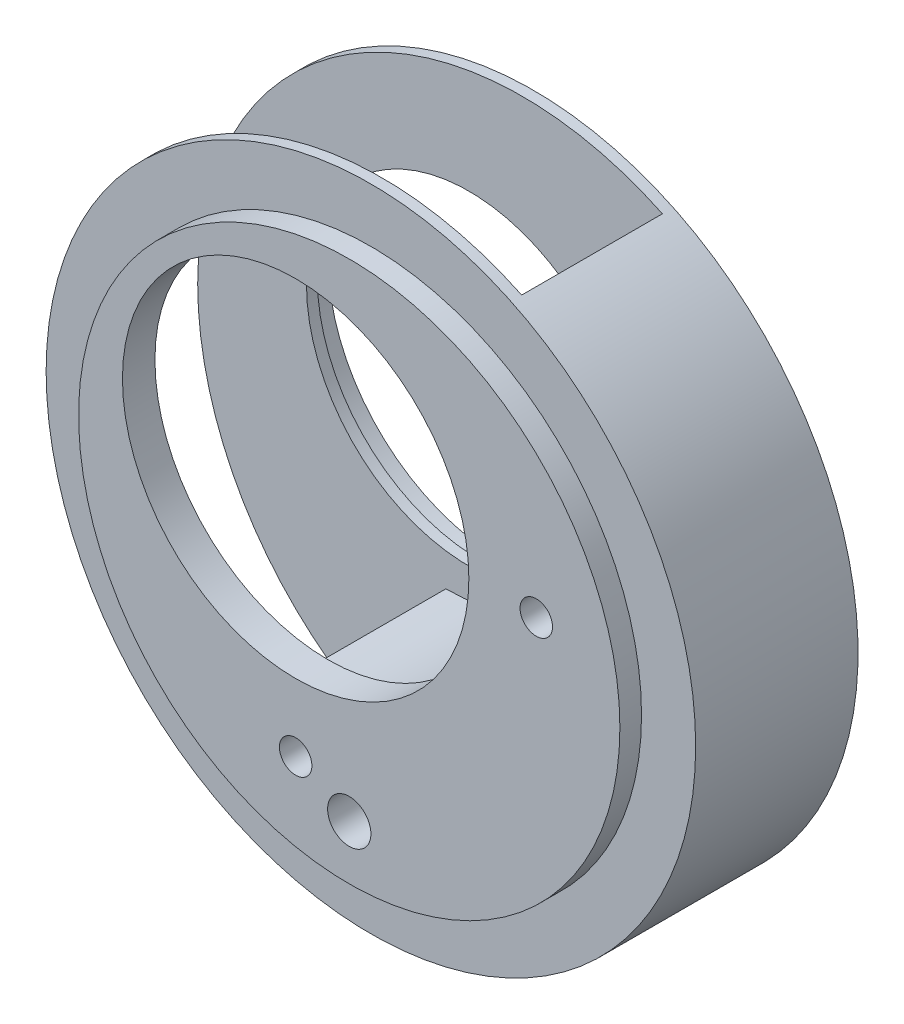
ISO-10303-21;
HEADER;
FILE_DESCRIPTION(('STEP AP214'),'2;1');
FILE_NAME('part.step','',(''),(''),'','','');
FILE_SCHEMA(('AUTOMOTIVE_DESIGN { 1 0 10303 214 1 1 1 1 }'));
ENDSEC;
DATA;
#1=APPLICATION_CONTEXT('core data for automotive mechanical design processes');
#2=APPLICATION_PROTOCOL_DEFINITION('international standard','automotive_design',2000,#1);
#3=PRODUCT_CONTEXT('',#1,'mechanical');
#4=PRODUCT('Part','Part','',(#3));
#5=PRODUCT_RELATED_PRODUCT_CATEGORY('part','',(#4));
#6=PRODUCT_DEFINITION_FORMATION('','',#4);
#7=PRODUCT_DEFINITION_CONTEXT('part definition',#1,'design');
#8=PRODUCT_DEFINITION('design','',#6,#7);
#9=PRODUCT_DEFINITION_SHAPE('','',#8);
#10=(LENGTH_UNIT() NAMED_UNIT(*) SI_UNIT(.MILLI.,.METRE.));
#11=(NAMED_UNIT(*) PLANE_ANGLE_UNIT() SI_UNIT($,.RADIAN.));
#12=(NAMED_UNIT(*) SI_UNIT($,.STERADIAN.) SOLID_ANGLE_UNIT());
#13=UNCERTAINTY_MEASURE_WITH_UNIT(LENGTH_MEASURE(1.E-05),#10,'distance_accuracy_value','');
#14=(GEOMETRIC_REPRESENTATION_CONTEXT(3) GLOBAL_UNCERTAINTY_ASSIGNED_CONTEXT((#13)) GLOBAL_UNIT_ASSIGNED_CONTEXT((#10,
#11,#12)) REPRESENTATION_CONTEXT('',''));
#15=CARTESIAN_POINT('',(0.,0.,0.));
#16=DIRECTION('',(0.,0.,1.));
#17=DIRECTION('',(1.,0.,0.));
#18=AXIS2_PLACEMENT_3D('',#15,#16,#17);
#19=CARTESIAN_POINT('',(-4.94974746830584,4.94974746830582,19.001));
#20=DIRECTION('',(0.,0.,-1.));
#21=DIRECTION('',(-1.,0.,0.));
#22=AXIS2_PLACEMENT_3D('',#19,#20,#21);
#23=CYLINDRICAL_SURFACE('',#22,15.);
#24=CARTESIAN_POINT('',(-4.94974746830584,4.94974746830582,3.));
#25=DIRECTION('',(0.,0.,1.));
#26=DIRECTION('',(1.,0.,0.));
#27=AXIS2_PLACEMENT_3D('',#24,#25,#26);
#28=CIRCLE('',#27,15.);
#29=CARTESIAN_POINT('',(10.0502525316942,4.94974746830582,3.));
#30=VERTEX_POINT('',#29);
#31=EDGE_CURVE('E220',#30,#30,#28,.F.);
#32=ORIENTED_EDGE('',*,*,#31,.F.);
#33=EDGE_LOOP('',(#32));
#34=FACE_BOUND('',#33,.T.);
#35=CARTESIAN_POINT('',(-4.94974746830584,4.94974746830582,2.));
#36=DIRECTION('',(0.,0.,-1.));
#37=DIRECTION('',(-1.,0.,0.));
#38=AXIS2_PLACEMENT_3D('',#35,#36,#37);
#39=CIRCLE('',#38,15.);
#40=CARTESIAN_POINT('',(-19.9497474683058,4.94974746830582,2.));
#41=VERTEX_POINT('',#40);
#42=EDGE_CURVE('E39',#41,#41,#39,.F.);
#43=ORIENTED_EDGE('',*,*,#42,.F.);
#44=EDGE_LOOP('',(#43));
#45=FACE_BOUND('',#44,.T.);
#46=ADVANCED_FACE('F35',(#34,#45),#23,.F.);
#47=CARTESIAN_POINT('',(0.,0.,19.));
#48=DIRECTION('',(0.,0.,-1.));
#49=DIRECTION('',(-1.,0.,0.));
#50=AXIS2_PLACEMENT_3D('',#47,#48,#49);
#51=CYLINDRICAL_SURFACE('',#50,30.);
#52=CARTESIAN_POINT('',(0.,0.,2.));
#53=DIRECTION('',(0.,0.,-1.));
#54=DIRECTION('',(-1.,0.,0.));
#55=AXIS2_PLACEMENT_3D('',#52,#53,#54);
#56=CIRCLE('',#55,30.);
#57=CARTESIAN_POINT('',(-30.,0.,2.));
#58=VERTEX_POINT('',#57);
#59=EDGE_CURVE('E121',#58,#58,#56,.T.);
#60=ORIENTED_EDGE('',*,*,#59,.F.);
#61=EDGE_LOOP('',(#60));
#62=FACE_BOUND('',#61,.T.);
#63=CARTESIAN_POINT('',(0.,0.,17.));
#64=DIRECTION('',(0.,0.,1.));
#65=DIRECTION('',(1.,0.,0.));
#66=AXIS2_PLACEMENT_3D('',#63,#64,#65);
#67=CIRCLE('',#66,30.);
#68=CARTESIAN_POINT('',(30.,0.,17.));
#69=VERTEX_POINT('',#68);
#70=EDGE_CURVE('E11',#69,#69,#67,.T.);
#71=ORIENTED_EDGE('',*,*,#70,.F.);
#72=EDGE_LOOP('',(#71));
#73=FACE_BOUND('',#72,.T.);
#74=CARTESIAN_POINT('',(0.,0.,3.));
#75=DIRECTION('',(0.,0.,1.));
#76=DIRECTION('',(1.,0.,0.));
#77=AXIS2_PLACEMENT_3D('',#74,#75,#76);
#78=CIRCLE('',#77,30.);
#79=CARTESIAN_POINT('',(12.9289321881345,27.0710678118655,3.));
#80=VERTEX_POINT('',#79);
#81=CARTESIAN_POINT('',(-7.07106781186547,-29.1547594742265,3.));
#82=VERTEX_POINT('',#81);
#83=EDGE_CURVE('E100',#80,#82,#78,.T.);
#84=ORIENTED_EDGE('',*,*,#83,.F.);
#85=DIRECTION('',(0.,0.,1.));
#86=VECTOR('',#85,1.);
#87=CARTESIAN_POINT('',(12.9289321881345,27.0710678118655,3.));
#88=LINE('',#87,#86);
#89=CARTESIAN_POINT('',(12.9289321881345,27.0710678118655,16.));
#90=VERTEX_POINT('',#89);
#91=EDGE_CURVE('E60',#80,#90,#88,.T.);
#92=ORIENTED_EDGE('',*,*,#91,.T.);
#93=CARTESIAN_POINT('',(0.,0.,16.));
#94=DIRECTION('',(0.,0.,1.));
#95=DIRECTION('',(1.,0.,0.));
#96=AXIS2_PLACEMENT_3D('',#93,#94,#95);
#97=CIRCLE('',#96,30.);
#98=CARTESIAN_POINT('',(-7.07106781186547,-29.1547594742265,16.));
#99=VERTEX_POINT('',#98);
#100=EDGE_CURVE('E76',#90,#99,#97,.T.);
#101=ORIENTED_EDGE('',*,*,#100,.T.);
#102=DIRECTION('',(0.,0.,1.));
#103=VECTOR('',#102,1.);
#104=CARTESIAN_POINT('',(-7.07106781186547,-29.1547594742265,3.));
#105=LINE('',#104,#103);
#106=EDGE_CURVE('E90',#82,#99,#105,.T.);
#107=ORIENTED_EDGE('',*,*,#106,.F.);
#108=EDGE_LOOP('',(#84,#92,#101,#107));
#109=FACE_BOUND('',#108,.T.);
#110=ADVANCED_FACE('F37',(#62,#73,#109),#51,.T.);
#111=CARTESIAN_POINT('',(0.,0.,17.));
#112=DIRECTION('',(0.,0.,1.));
#113=DIRECTION('',(1.,0.,0.));
#114=AXIS2_PLACEMENT_3D('',#111,#112,#113);
#115=PLANE('',#114);
#116=CARTESIAN_POINT('',(0.,0.,17.));
#117=DIRECTION('',(0.,0.,1.));
#118=DIRECTION('',(1.,0.,0.));
#119=AXIS2_PLACEMENT_3D('',#116,#117,#118);
#120=CIRCLE('',#119,25.);
#121=CARTESIAN_POINT('',(25.,0.,17.));
#122=VERTEX_POINT('',#121);
#123=EDGE_CURVE('E44',#122,#122,#120,.T.);
#124=ORIENTED_EDGE('',*,*,#123,.F.);
#125=EDGE_LOOP('',(#124));
#126=FACE_BOUND('',#125,.T.);
#127=ORIENTED_EDGE('',*,*,#70,.T.);
#128=EDGE_LOOP('',(#127));
#129=FACE_BOUND('',#128,.T.);
#130=ADVANCED_FACE('F136',(#126,#129),#115,.T.);
#131=CARTESIAN_POINT('',(0.,0.,17.));
#132=DIRECTION('',(0.,0.,1.));
#133=DIRECTION('',(1.,0.,0.));
#134=AXIS2_PLACEMENT_3D('',#131,#132,#133);
#135=CYLINDRICAL_SURFACE('',#134,25.);
#136=ORIENTED_EDGE('',*,*,#123,.T.);
#137=EDGE_LOOP('',(#136));
#138=FACE_BOUND('',#137,.T.);
#139=CARTESIAN_POINT('',(0.,0.,19.));
#140=DIRECTION('',(0.,0.,1.));
#141=DIRECTION('',(1.,0.,0.));
#142=AXIS2_PLACEMENT_3D('',#139,#140,#141);
#143=CIRCLE('',#142,25.);
#144=CARTESIAN_POINT('',(25.,0.,19.));
#145=VERTEX_POINT('',#144);
#146=EDGE_CURVE('E126',#145,#145,#143,.T.);
#147=ORIENTED_EDGE('',*,*,#146,.F.);
#148=EDGE_LOOP('',(#147));
#149=FACE_BOUND('',#148,.T.);
#150=ADVANCED_FACE('F134',(#138,#149),#135,.T.);
#151=CARTESIAN_POINT('',(0.,0.,19.));
#152=DIRECTION('',(0.,0.,1.));
#153=DIRECTION('',(1.,0.,0.));
#154=AXIS2_PLACEMENT_3D('',#151,#152,#153);
#155=PLANE('',#154);
#156=CARTESIAN_POINT('',(-4.94974746830583,-17.2776770206899,19.));
#157=DIRECTION('',(0.,0.,1.));
#158=DIRECTION('',(1.,0.,0.));
#159=AXIS2_PLACEMENT_3D('',#156,#157,#158);
#160=CIRCLE('',#159,1.5);
#161=CARTESIAN_POINT('',(-3.44974746830583,-17.2776770206899,19.));
#162=VERTEX_POINT('',#161);
#163=EDGE_CURVE('E268',#162,#162,#160,.T.);
#164=ORIENTED_EDGE('',*,*,#163,.F.);
#165=EDGE_LOOP('',(#164));
#166=FACE_BOUND('',#165,.T.);
#167=CARTESIAN_POINT('',(17.2776770206899,4.94974746830584,19.));
#168=DIRECTION('',(0.,0.,1.));
#169=DIRECTION('',(1.,0.,0.));
#170=AXIS2_PLACEMENT_3D('',#167,#168,#169);
#171=CIRCLE('',#170,1.5);
#172=CARTESIAN_POINT('',(18.7776770206899,4.94974746830584,19.));
#173=VERTEX_POINT('',#172);
#174=EDGE_CURVE('E277',#173,#173,#171,.T.);
#175=ORIENTED_EDGE('',*,*,#174,.F.);
#176=EDGE_LOOP('',(#175));
#177=FACE_BOUND('',#176,.T.);
#178=CARTESIAN_POINT('',(0.,-20.,19.));
#179=DIRECTION('',(0.,0.,1.));
#180=DIRECTION('',(1.,0.,0.));
#181=AXIS2_PLACEMENT_3D('',#178,#179,#180);
#182=CIRCLE('',#181,2.);
#183=CARTESIAN_POINT('',(2.,-20.,19.));
#184=VERTEX_POINT('',#183);
#185=EDGE_CURVE('E216',#184,#184,#182,.T.);
#186=ORIENTED_EDGE('',*,*,#185,.F.);
#187=EDGE_LOOP('',(#186));
#188=FACE_BOUND('',#187,.T.);
#189=CARTESIAN_POINT('',(-4.94974746830583,4.94974746830584,19.));
#190=DIRECTION('',(0.,0.,1.));
#191=DIRECTION('',(1.,0.,0.));
#192=AXIS2_PLACEMENT_3D('',#189,#190,#191);
#193=CIRCLE('',#192,16.);
#194=CARTESIAN_POINT('',(11.0502525316942,4.94974746830584,19.));
#195=VERTEX_POINT('',#194);
#196=EDGE_CURVE('E223',#195,#195,#193,.T.);
#197=ORIENTED_EDGE('',*,*,#196,.F.);
#198=EDGE_LOOP('',(#197));
#199=FACE_BOUND('',#198,.T.);
#200=ORIENTED_EDGE('',*,*,#146,.T.);
#201=EDGE_LOOP('',(#200));
#202=FACE_BOUND('',#201,.T.);
#203=ADVANCED_FACE('F132',(#166,#177,#188,#199,#202),#155,.T.);
#204=CARTESIAN_POINT('',(0.,0.,2.));
#205=DIRECTION('',(0.,0.,-1.));
#206=DIRECTION('',(-1.,0.,0.));
#207=AXIS2_PLACEMENT_3D('',#204,#205,#206);
#208=PLANE('',#207);
#209=CARTESIAN_POINT('',(0.,0.,2.));
#210=DIRECTION('',(0.,0.,-1.));
#211=DIRECTION('',(-1.,0.,0.));
#212=AXIS2_PLACEMENT_3D('',#209,#210,#211);
#213=CIRCLE('',#212,25.);
#214=CARTESIAN_POINT('',(-25.,0.,2.));
#215=VERTEX_POINT('',#214);
#216=EDGE_CURVE('E118',#215,#215,#213,.T.);
#217=ORIENTED_EDGE('',*,*,#216,.F.);
#218=EDGE_LOOP('',(#217));
#219=FACE_BOUND('',#218,.T.);
#220=ORIENTED_EDGE('',*,*,#59,.T.);
#221=EDGE_LOOP('',(#220));
#222=FACE_BOUND('',#221,.T.);
#223=ADVANCED_FACE('F144',(#219,#222),#208,.T.);
#224=CARTESIAN_POINT('',(0.,0.,2.));
#225=DIRECTION('',(0.,0.,-1.));
#226=DIRECTION('',(-1.,0.,0.));
#227=AXIS2_PLACEMENT_3D('',#224,#225,#226);
#228=CYLINDRICAL_SURFACE('',#227,25.);
#229=ORIENTED_EDGE('',*,*,#216,.T.);
#230=EDGE_LOOP('',(#229));
#231=FACE_BOUND('',#230,.T.);
#232=CARTESIAN_POINT('',(0.,0.,0.));
#233=DIRECTION('',(0.,0.,-1.));
#234=DIRECTION('',(-1.,0.,0.));
#235=AXIS2_PLACEMENT_3D('',#232,#233,#234);
#236=CIRCLE('',#235,25.);
#237=CARTESIAN_POINT('',(-25.,0.,0.));
#238=VERTEX_POINT('',#237);
#239=EDGE_CURVE('E115',#238,#238,#236,.T.);
#240=ORIENTED_EDGE('',*,*,#239,.F.);
#241=EDGE_LOOP('',(#240));
#242=FACE_BOUND('',#241,.T.);
#243=ADVANCED_FACE('F185',(#231,#242),#228,.T.);
#244=CARTESIAN_POINT('',(0.,0.,0.));
#245=DIRECTION('',(0.,0.,1.));
#246=DIRECTION('',(1.,0.,0.));
#247=AXIS2_PLACEMENT_3D('',#244,#245,#246);
#248=PLANE('',#247);
#249=CARTESIAN_POINT('',(-4.94974746830584,4.94974746830582,0.));
#250=DIRECTION('',(0.,0.,-1.));
#251=DIRECTION('',(-1.,0.,0.));
#252=AXIS2_PLACEMENT_3D('',#249,#250,#251);
#253=CIRCLE('',#252,16.);
#254=CARTESIAN_POINT('',(-20.9497474683058,4.94974746830582,0.));
#255=VERTEX_POINT('',#254);
#256=EDGE_CURVE('E208',#255,#255,#253,.T.);
#257=ORIENTED_EDGE('',*,*,#256,.F.);
#258=EDGE_LOOP('',(#257));
#259=FACE_BOUND('',#258,.T.);
#260=ORIENTED_EDGE('',*,*,#239,.T.);
#261=EDGE_LOOP('',(#260));
#262=FACE_BOUND('',#261,.T.);
#263=ADVANCED_FACE('F180',(#259,#262),#248,.F.);
#264=CARTESIAN_POINT('',(7.07106781186545,21.2132034355964,3.));
#265=DIRECTION('',(0.707106781186549,-0.707106781186546,0.));
#266=DIRECTION('',(0.707106781186546,0.707106781186549,0.));
#267=AXIS2_PLACEMENT_3D('',#264,#265,#266);
#268=PLANE('',#267);
#269=DIRECTION('',(0.707106781186546,0.707106781186549,0.));
#270=VECTOR('',#269,1.);
#271=CARTESIAN_POINT('',(7.07106781186545,21.2132034355964,16.));
#272=LINE('',#271,#270);
#273=CARTESIAN_POINT('',(7.07106781186545,21.2132034355964,16.));
#274=VERTEX_POINT('',#273);
#275=EDGE_CURVE('E103',#274,#90,#272,.T.);
#276=ORIENTED_EDGE('',*,*,#275,.T.);
#277=ORIENTED_EDGE('',*,*,#91,.F.);
#278=DIRECTION('',(0.707106781186546,0.707106781186549,0.));
#279=VECTOR('',#278,1.);
#280=CARTESIAN_POINT('',(7.07106781186545,21.2132034355964,3.));
#281=LINE('',#280,#279);
#282=CARTESIAN_POINT('',(7.07106781186545,21.2132034355964,3.));
#283=VERTEX_POINT('',#282);
#284=EDGE_CURVE('E96',#283,#80,#281,.T.);
#285=ORIENTED_EDGE('',*,*,#284,.F.);
#286=DIRECTION('',(0.,0.,1.));
#287=VECTOR('',#286,1.);
#288=CARTESIAN_POINT('',(7.07106781186545,21.2132034355964,3.));
#289=LINE('',#288,#287);
#290=EDGE_CURVE('E89',#283,#274,#289,.T.);
#291=ORIENTED_EDGE('',*,*,#290,.T.);
#292=EDGE_LOOP('',(#276,#277,#285,#291));
#293=FACE_BOUND('',#292,.T.);
#294=ADVANCED_FACE('F177',(#293),#268,.F.);
#295=CARTESIAN_POINT('',(-7.07106781186547,7.07106781186547,3.));
#296=DIRECTION('',(0.,0.,1.));
#297=DIRECTION('',(1.,0.,0.));
#298=AXIS2_PLACEMENT_3D('',#295,#296,#297);
#299=CYLINDRICAL_SURFACE('',#298,20.);
#300=CARTESIAN_POINT('',(-7.07106781186547,7.07106781186547,16.));
#301=DIRECTION('',(0.,0.,1.));
#302=DIRECTION('',(1.,0.,0.));
#303=AXIS2_PLACEMENT_3D('',#300,#301,#302);
#304=CIRCLE('',#303,20.);
#305=CARTESIAN_POINT('',(-7.07106781186548,-12.9289321881345,16.));
#306=VERTEX_POINT('',#305);
#307=EDGE_CURVE('E111',#306,#274,#304,.T.);
#308=ORIENTED_EDGE('',*,*,#307,.T.);
#309=ORIENTED_EDGE('',*,*,#290,.F.);
#310=CARTESIAN_POINT('',(-7.07106781186547,7.07106781186547,3.));
#311=DIRECTION('',(0.,0.,1.));
#312=DIRECTION('',(1.,0.,0.));
#313=AXIS2_PLACEMENT_3D('',#310,#311,#312);
#314=CIRCLE('',#313,20.);
#315=CARTESIAN_POINT('',(-7.07106781186548,-12.9289321881345,3.));
#316=VERTEX_POINT('',#315);
#317=EDGE_CURVE('E93',#316,#283,#314,.T.);
#318=ORIENTED_EDGE('',*,*,#317,.F.);
#319=DIRECTION('',(0.,0.,1.));
#320=VECTOR('',#319,1.);
#321=CARTESIAN_POINT('',(-7.07106781186548,-12.9289321881345,3.));
#322=LINE('',#321,#320);
#323=EDGE_CURVE('E84',#316,#306,#322,.T.);
#324=ORIENTED_EDGE('',*,*,#323,.T.);
#325=EDGE_LOOP('',(#308,#309,#318,#324));
#326=FACE_BOUND('',#325,.T.);
#327=ADVANCED_FACE('F94',(#326),#299,.F.);
#328=CARTESIAN_POINT('',(-7.07106781186547,-12.9289321881345,3.));
#329=DIRECTION('',(1.,0.,0.));
#330=DIRECTION('',(0.,0.,-1.));
#331=AXIS2_PLACEMENT_3D('',#328,#329,#330);
#332=PLANE('',#331);
#333=DIRECTION('',(0.,1.,0.));
#334=VECTOR('',#333,1.);
#335=CARTESIAN_POINT('',(-7.07106781186547,-12.9289321881345,16.));
#336=LINE('',#335,#334);
#337=EDGE_CURVE('E51',#99,#306,#336,.T.);
#338=ORIENTED_EDGE('',*,*,#337,.T.);
#339=ORIENTED_EDGE('',*,*,#323,.F.);
#340=DIRECTION('',(0.,1.,0.));
#341=VECTOR('',#340,1.);
#342=CARTESIAN_POINT('',(-7.07106781186547,-12.9289321881345,3.));
#343=LINE('',#342,#341);
#344=EDGE_CURVE('E82',#82,#316,#343,.T.);
#345=ORIENTED_EDGE('',*,*,#344,.F.);
#346=ORIENTED_EDGE('',*,*,#106,.T.);
#347=EDGE_LOOP('',(#338,#339,#345,#346));
#348=FACE_BOUND('',#347,.T.);
#349=ADVANCED_FACE('F86',(#348),#332,.F.);
#350=CARTESIAN_POINT('',(0.,0.,3.));
#351=DIRECTION('',(0.,0.,1.));
#352=DIRECTION('',(1.,0.,0.));
#353=AXIS2_PLACEMENT_3D('',#350,#351,#352);
#354=PLANE('',#353);
#355=ORIENTED_EDGE('',*,*,#31,.T.);
#356=EDGE_LOOP('',(#355));
#357=FACE_BOUND('',#356,.T.);
#358=ORIENTED_EDGE('',*,*,#83,.T.);
#359=ORIENTED_EDGE('',*,*,#344,.T.);
#360=ORIENTED_EDGE('',*,*,#317,.T.);
#361=ORIENTED_EDGE('',*,*,#284,.T.);
#362=EDGE_LOOP('',(#358,#359,#360,#361));
#363=FACE_BOUND('',#362,.T.);
#364=ADVANCED_FACE('F98',(#357,#363),#354,.T.);
#365=CARTESIAN_POINT('',(0.,0.,16.));
#366=DIRECTION('',(0.,0.,1.));
#367=DIRECTION('',(1.,0.,0.));
#368=AXIS2_PLACEMENT_3D('',#365,#366,#367);
#369=PLANE('',#368);
#370=CARTESIAN_POINT('',(-4.94974746830583,4.94974746830584,16.));
#371=DIRECTION('',(0.,0.,1.));
#372=DIRECTION('',(1.,0.,0.));
#373=AXIS2_PLACEMENT_3D('',#370,#371,#372);
#374=CIRCLE('',#373,16.);
#375=CARTESIAN_POINT('',(11.0502525316942,4.94974746830584,16.));
#376=VERTEX_POINT('',#375);
#377=EDGE_CURVE('E109',#376,#376,#374,.F.);
#378=ORIENTED_EDGE('',*,*,#377,.F.);
#379=EDGE_LOOP('',(#378));
#380=FACE_BOUND('',#379,.T.);
#381=ORIENTED_EDGE('',*,*,#100,.F.);
#382=ORIENTED_EDGE('',*,*,#275,.F.);
#383=ORIENTED_EDGE('',*,*,#307,.F.);
#384=ORIENTED_EDGE('',*,*,#337,.F.);
#385=EDGE_LOOP('',(#381,#382,#383,#384));
#386=FACE_BOUND('',#385,.T.);
#387=ADVANCED_FACE('F169',(#380,#386),#369,.F.);
#388=CARTESIAN_POINT('',(-4.94974746830583,4.94974746830584,-0.001000000000001));
#389=DIRECTION('',(0.,0.,1.));
#390=DIRECTION('',(1.,0.,0.));
#391=AXIS2_PLACEMENT_3D('',#388,#389,#390);
#392=CYLINDRICAL_SURFACE('',#391,16.);
#393=ORIENTED_EDGE('',*,*,#196,.T.);
#394=EDGE_LOOP('',(#393));
#395=FACE_BOUND('',#394,.T.);
#396=ORIENTED_EDGE('',*,*,#377,.T.);
#397=EDGE_LOOP('',(#396));
#398=FACE_BOUND('',#397,.T.);
#399=ADVANCED_FACE('F165',(#395,#398),#392,.F.);
#400=CARTESIAN_POINT('',(-4.94974746830584,4.94974746830582,2.));
#401=DIRECTION('',(0.,0.,-1.));
#402=DIRECTION('',(-1.,0.,0.));
#403=AXIS2_PLACEMENT_3D('',#400,#401,#402);
#404=PLANE('',#403);
#405=CARTESIAN_POINT('',(-4.94974746830584,4.94974746830582,2.));
#406=DIRECTION('',(0.,0.,-1.));
#407=DIRECTION('',(-1.,0.,0.));
#408=AXIS2_PLACEMENT_3D('',#405,#406,#407);
#409=CIRCLE('',#408,16.);
#410=CARTESIAN_POINT('',(-20.9497474683058,4.94974746830582,2.));
#411=VERTEX_POINT('',#410);
#412=EDGE_CURVE('E210',#411,#411,#409,.T.);
#413=ORIENTED_EDGE('',*,*,#412,.T.);
#414=EDGE_LOOP('',(#413));
#415=FACE_BOUND('',#414,.T.);
#416=ORIENTED_EDGE('',*,*,#42,.T.);
#417=EDGE_LOOP('',(#416));
#418=FACE_BOUND('',#417,.T.);
#419=ADVANCED_FACE('F168',(#415,#418),#404,.T.);
#420=CARTESIAN_POINT('',(-4.94974746830584,4.94974746830582,2.));
#421=DIRECTION('',(0.,0.,-1.));
#422=DIRECTION('',(-1.,0.,0.));
#423=AXIS2_PLACEMENT_3D('',#420,#421,#422);
#424=CYLINDRICAL_SURFACE('',#423,16.);
#425=ORIENTED_EDGE('',*,*,#412,.F.);
#426=EDGE_LOOP('',(#425));
#427=FACE_BOUND('',#426,.T.);
#428=ORIENTED_EDGE('',*,*,#256,.T.);
#429=EDGE_LOOP('',(#428));
#430=FACE_BOUND('',#429,.T.);
#431=ADVANCED_FACE('F163',(#427,#430),#424,.F.);
#432=CARTESIAN_POINT('',(0.,-20.,16.));
#433=DIRECTION('',(0.,0.,1.));
#434=DIRECTION('',(1.,0.,0.));
#435=AXIS2_PLACEMENT_3D('',#432,#433,#434);
#436=CYLINDRICAL_SURFACE('',#435,2.);
#437=CARTESIAN_POINT('',(0.,-20.,16.));
#438=DIRECTION('',(0.,0.,1.));
#439=DIRECTION('',(1.,0.,0.));
#440=AXIS2_PLACEMENT_3D('',#437,#438,#439);
#441=CIRCLE('',#440,2.);
#442=CARTESIAN_POINT('',(2.,-20.,16.));
#443=VERTEX_POINT('',#442);
#444=EDGE_CURVE('E211',#443,#443,#441,.T.);
#445=ORIENTED_EDGE('',*,*,#444,.F.);
#446=EDGE_LOOP('',(#445));
#447=FACE_BOUND('',#446,.T.);
#448=ORIENTED_EDGE('',*,*,#185,.T.);
#449=EDGE_LOOP('',(#448));
#450=FACE_BOUND('',#449,.T.);
#451=ADVANCED_FACE('F238',(#447,#450),#436,.F.);
#452=CARTESIAN_POINT('',(0.,-20.,16.));
#453=DIRECTION('',(0.,0.,1.));
#454=DIRECTION('',(1.,0.,0.));
#455=AXIS2_PLACEMENT_3D('',#452,#453,#454);
#456=PLANE('',#455);
#457=ORIENTED_EDGE('',*,*,#444,.T.);
#458=EDGE_LOOP('',(#457));
#459=FACE_BOUND('',#458,.T.);
#460=ADVANCED_FACE('F243',(#459),#456,.T.);
#461=CARTESIAN_POINT('',(17.2776770206899,4.94974746830584,16.));
#462=DIRECTION('',(0.,0.,1.));
#463=DIRECTION('',(1.,0.,0.));
#464=AXIS2_PLACEMENT_3D('',#461,#462,#463);
#465=CYLINDRICAL_SURFACE('',#464,1.5);
#466=CARTESIAN_POINT('',(17.2776770206899,4.94974746830584,16.));
#467=DIRECTION('',(0.,0.,1.));
#468=DIRECTION('',(1.,0.,0.));
#469=AXIS2_PLACEMENT_3D('',#466,#467,#468);
#470=CIRCLE('',#469,1.5);
#471=CARTESIAN_POINT('',(18.7776770206899,4.94974746830584,16.));
#472=VERTEX_POINT('',#471);
#473=EDGE_CURVE('E272',#472,#472,#470,.T.);
#474=ORIENTED_EDGE('',*,*,#473,.F.);
#475=EDGE_LOOP('',(#474));
#476=FACE_BOUND('',#475,.T.);
#477=ORIENTED_EDGE('',*,*,#174,.T.);
#478=EDGE_LOOP('',(#477));
#479=FACE_BOUND('',#478,.T.);
#480=ADVANCED_FACE('F247',(#476,#479),#465,.F.);
#481=CARTESIAN_POINT('',(17.2776770206899,4.94974746830584,16.));
#482=DIRECTION('',(0.,0.,1.));
#483=DIRECTION('',(1.,0.,0.));
#484=AXIS2_PLACEMENT_3D('',#481,#482,#483);
#485=PLANE('',#484);
#486=ORIENTED_EDGE('',*,*,#473,.T.);
#487=EDGE_LOOP('',(#486));
#488=FACE_BOUND('',#487,.T.);
#489=ADVANCED_FACE('F251',(#488),#485,.T.);
#490=CARTESIAN_POINT('',(-4.94974746830583,-17.2776770206899,16.));
#491=DIRECTION('',(0.,0.,1.));
#492=DIRECTION('',(1.,0.,0.));
#493=AXIS2_PLACEMENT_3D('',#490,#491,#492);
#494=CYLINDRICAL_SURFACE('',#493,1.5);
#495=CARTESIAN_POINT('',(-4.94974746830583,-17.2776770206899,16.));
#496=DIRECTION('',(0.,0.,1.));
#497=DIRECTION('',(1.,0.,0.));
#498=AXIS2_PLACEMENT_3D('',#495,#496,#497);
#499=CIRCLE('',#498,1.5);
#500=CARTESIAN_POINT('',(-3.44974746830583,-17.2776770206899,16.));
#501=VERTEX_POINT('',#500);
#502=EDGE_CURVE('E267',#501,#501,#499,.T.);
#503=ORIENTED_EDGE('',*,*,#502,.F.);
#504=EDGE_LOOP('',(#503));
#505=FACE_BOUND('',#504,.T.);
#506=ORIENTED_EDGE('',*,*,#163,.T.);
#507=EDGE_LOOP('',(#506));
#508=FACE_BOUND('',#507,.T.);
#509=ADVANCED_FACE('F255',(#505,#508),#494,.F.);
#510=CARTESIAN_POINT('',(-4.94974746830583,-17.2776770206899,16.));
#511=DIRECTION('',(0.,0.,1.));
#512=DIRECTION('',(1.,0.,0.));
#513=AXIS2_PLACEMENT_3D('',#510,#511,#512);
#514=PLANE('',#513);
#515=ORIENTED_EDGE('',*,*,#502,.T.);
#516=EDGE_LOOP('',(#515));
#517=FACE_BOUND('',#516,.T.);
#518=ADVANCED_FACE('F259',(#517),#514,.T.);
#519=CLOSED_SHELL('',(#46,#110,#130,#150,#203,#223,#243,#263,#294,#327,#349,#364,#387,#399,#419,
#431,#451,#460,#480,#489,#509,#518));
#520=MANIFOLD_SOLID_BREP('B2',#519);
#521=ADVANCED_BREP_SHAPE_REPRESENTATION('',(#18,#520),#14);
#522=SHAPE_DEFINITION_REPRESENTATION(#9,#521);
ENDSEC;
END-ISO-10303-21;
